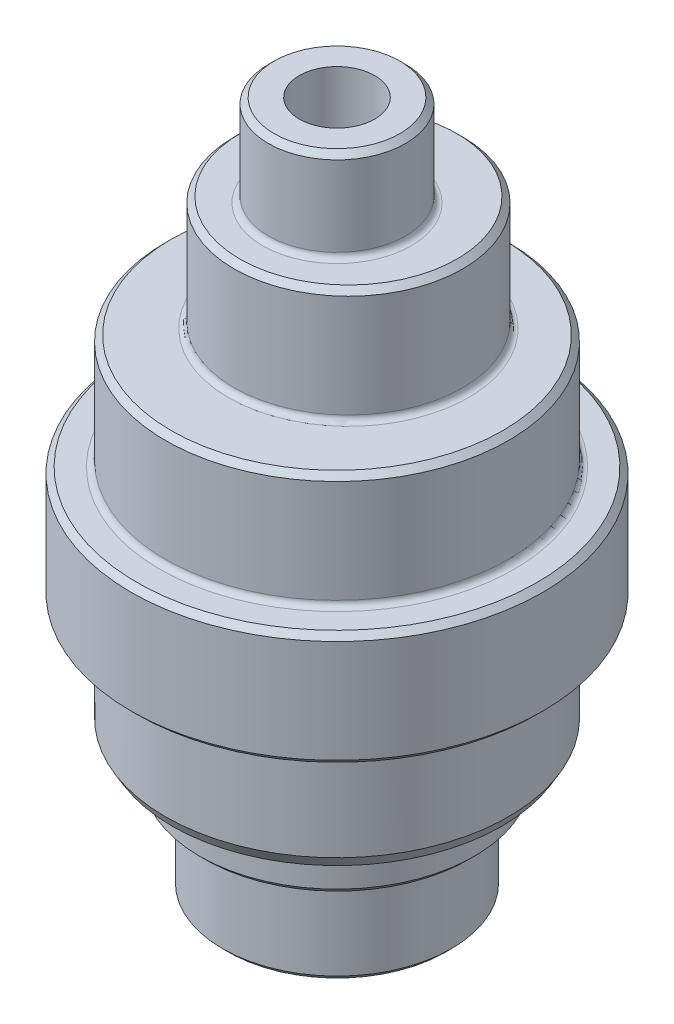
ISO-10303-21;
HEADER;
FILE_DESCRIPTION(('STEP AP214'),'2;1');
FILE_NAME('part.step','',(''),(''),'','','');
FILE_SCHEMA(('AUTOMOTIVE_DESIGN { 1 0 10303 214 1 1 1 1 }'));
ENDSEC;
DATA;
#1=APPLICATION_CONTEXT('core data for automotive mechanical design processes');
#2=APPLICATION_PROTOCOL_DEFINITION('international standard','automotive_design',2000,#1);
#3=PRODUCT_CONTEXT('',#1,'mechanical');
#4=PRODUCT('Part','Part','',(#3));
#5=PRODUCT_RELATED_PRODUCT_CATEGORY('part','',(#4));
#6=PRODUCT_DEFINITION_FORMATION('','',#4);
#7=PRODUCT_DEFINITION_CONTEXT('part definition',#1,'design');
#8=PRODUCT_DEFINITION('design','',#6,#7);
#9=PRODUCT_DEFINITION_SHAPE('','',#8);
#10=(LENGTH_UNIT() NAMED_UNIT(*) SI_UNIT(.MILLI.,.METRE.));
#11=(NAMED_UNIT(*) PLANE_ANGLE_UNIT() SI_UNIT($,.RADIAN.));
#12=(NAMED_UNIT(*) SI_UNIT($,.STERADIAN.) SOLID_ANGLE_UNIT());
#13=UNCERTAINTY_MEASURE_WITH_UNIT(LENGTH_MEASURE(1.E-05),#10,'distance_accuracy_value','');
#14=(GEOMETRIC_REPRESENTATION_CONTEXT(3) GLOBAL_UNCERTAINTY_ASSIGNED_CONTEXT((#13)) GLOBAL_UNIT_ASSIGNED_CONTEXT((#10,
#11,#12)) REPRESENTATION_CONTEXT('',''));
#15=CARTESIAN_POINT('',(0.,0.,0.));
#16=DIRECTION('',(0.,0.,1.));
#17=DIRECTION('',(1.,0.,0.));
#18=AXIS2_PLACEMENT_3D('',#15,#16,#17);
#19=CARTESIAN_POINT('',(0.,-15.,0.5));
#20=DIRECTION('',(0.,-1.,0.));
#21=DIRECTION('',(0.,0.,-1.));
#22=AXIS2_PLACEMENT_3D('',#19,#20,#21);
#23=PLANE('',#22);
#24=CARTESIAN_POINT('',(0.,-15.,0.5));
#25=DIRECTION('',(0.,-1.,0.));
#26=DIRECTION('',(0.,0.,-1.));
#27=AXIS2_PLACEMENT_3D('',#24,#25,#26);
#28=CIRCLE('',#27,7.21132486540519);
#29=CARTESIAN_POINT('',(0.,-15.,-6.71132486540519));
#30=VERTEX_POINT('',#29);
#31=EDGE_CURVE('E11',#30,#30,#28,.T.);
#32=ORIENTED_EDGE('',*,*,#31,.T.);
#33=EDGE_LOOP('',(#32));
#34=FACE_BOUND('',#33,.T.);
#35=CARTESIAN_POINT('',(0.,-15.,0.5));
#36=DIRECTION('',(0.,-1.,0.));
#37=DIRECTION('',(0.,0.,-1.));
#38=AXIS2_PLACEMENT_3D('',#35,#36,#37);
#39=CIRCLE('',#38,6.25);
#40=CARTESIAN_POINT('',(0.,-15.,-5.75));
#41=VERTEX_POINT('',#40);
#42=EDGE_CURVE('E139',#41,#41,#39,.F.);
#43=ORIENTED_EDGE('',*,*,#42,.T.);
#44=EDGE_LOOP('',(#43));
#45=FACE_BOUND('',#44,.T.);
#46=ADVANCED_FACE('F46',(#34,#45),#23,.T.);
#47=CARTESIAN_POINT('',(0.,-15.,0.5));
#48=DIRECTION('',(0.,1.,0.));
#49=DIRECTION('',(0.,0.,1.));
#50=AXIS2_PLACEMENT_3D('',#47,#48,#49);
#51=CYLINDRICAL_SURFACE('',#50,7.5);
#52=CARTESIAN_POINT('',(0.,-4.75000000000001,0.5));
#53=DIRECTION('',(0.,-1.,0.));
#54=DIRECTION('',(0.,0.,-1.));
#55=AXIS2_PLACEMENT_3D('',#52,#53,#54);
#56=CIRCLE('',#55,7.5);
#57=CARTESIAN_POINT('',(0.,-4.75000000000001,-7.));
#58=VERTEX_POINT('',#57);
#59=EDGE_CURVE('E155',#58,#58,#56,.F.);
#60=ORIENTED_EDGE('',*,*,#59,.T.);
#61=EDGE_LOOP('',(#60));
#62=FACE_BOUND('',#61,.T.);
#63=CARTESIAN_POINT('',(0.,-0.250000000000007,0.5));
#64=DIRECTION('',(0.,-1.,0.));
#65=DIRECTION('',(0.,0.,-1.));
#66=AXIS2_PLACEMENT_3D('',#63,#64,#65);
#67=CIRCLE('',#66,7.5);
#68=CARTESIAN_POINT('',(0.,-0.250000000000007,-7.));
#69=VERTEX_POINT('',#68);
#70=EDGE_CURVE('E103',#69,#69,#67,.T.);
#71=ORIENTED_EDGE('',*,*,#70,.T.);
#72=EDGE_LOOP('',(#71));
#73=FACE_BOUND('',#72,.T.);
#74=ADVANCED_FACE('F208',(#62,#73),#51,.T.);
#75=CARTESIAN_POINT('',(0.,5.,0.));
#76=DIRECTION('',(0.,-1.,0.));
#77=DIRECTION('',(0.,0.,-1.));
#78=AXIS2_PLACEMENT_3D('',#75,#76,#77);
#79=CYLINDRICAL_SURFACE('',#78,5.);
#80=CARTESIAN_POINT('',(0.,0.25,0.));
#81=DIRECTION('',(0.,-1.,0.));
#82=DIRECTION('',(0.,0.,-1.));
#83=AXIS2_PLACEMENT_3D('',#80,#81,#82);
#84=CIRCLE('',#83,5.);
#85=CARTESIAN_POINT('',(0.,0.25,-5.));
#86=VERTEX_POINT('',#85);
#87=EDGE_CURVE('E123',#86,#86,#84,.F.);
#88=ORIENTED_EDGE('',*,*,#87,.T.);
#89=EDGE_LOOP('',(#88));
#90=FACE_BOUND('',#89,.T.);
#91=CARTESIAN_POINT('',(0.,4.75000000000001,0.));
#92=DIRECTION('',(0.,1.,0.));
#93=DIRECTION('',(0.,0.,1.));
#94=AXIS2_PLACEMENT_3D('',#91,#92,#93);
#95=CIRCLE('',#94,5.);
#96=CARTESIAN_POINT('',(0.,4.75000000000001,5.));
#97=VERTEX_POINT('',#96);
#98=EDGE_CURVE('E99',#97,#97,#95,.F.);
#99=ORIENTED_EDGE('',*,*,#98,.T.);
#100=EDGE_LOOP('',(#99));
#101=FACE_BOUND('',#100,.T.);
#102=ADVANCED_FACE('F214',(#90,#101),#79,.T.);
#103=CARTESIAN_POINT('',(0.,5.,0.));
#104=DIRECTION('',(0.,1.,0.));
#105=DIRECTION('',(0.,0.,1.));
#106=AXIS2_PLACEMENT_3D('',#103,#104,#105);
#107=PLANE('',#106);
#108=CARTESIAN_POINT('',(0.,5.,0.5));
#109=DIRECTION('',(0.,1.,0.));
#110=DIRECTION('',(0.,0.,1.));
#111=AXIS2_PLACEMENT_3D('',#108,#109,#110);
#112=CIRCLE('',#111,3.25);
#113=CARTESIAN_POINT('',(0.,5.,3.75));
#114=VERTEX_POINT('',#113);
#115=EDGE_CURVE('E115',#114,#114,#112,.F.);
#116=ORIENTED_EDGE('',*,*,#115,.T.);
#117=EDGE_LOOP('',(#116));
#118=FACE_BOUND('',#117,.T.);
#119=CARTESIAN_POINT('',(0.,5.,0.));
#120=DIRECTION('',(0.,1.,0.));
#121=DIRECTION('',(0.,0.,1.));
#122=AXIS2_PLACEMENT_3D('',#119,#120,#121);
#123=CIRCLE('',#122,4.75000000000001);
#124=CARTESIAN_POINT('',(0.,5.,4.75000000000001));
#125=VERTEX_POINT('',#124);
#126=EDGE_CURVE('E95',#125,#125,#123,.T.);
#127=ORIENTED_EDGE('',*,*,#126,.T.);
#128=EDGE_LOOP('',(#127));
#129=FACE_BOUND('',#128,.T.);
#130=ADVANCED_FACE('F313',(#118,#129),#107,.T.);
#131=CARTESIAN_POINT('',(0.,9.,0.5));
#132=DIRECTION('',(0.,-1.,0.));
#133=DIRECTION('',(0.,0.,-1.));
#134=AXIS2_PLACEMENT_3D('',#131,#132,#133);
#135=CYLINDRICAL_SURFACE('',#134,3.);
#136=CARTESIAN_POINT('',(0.,5.25,0.5));
#137=DIRECTION('',(0.,1.,0.));
#138=DIRECTION('',(0.,0.,1.));
#139=AXIS2_PLACEMENT_3D('',#136,#137,#138);
#140=CIRCLE('',#139,3.);
#141=CARTESIAN_POINT('',(0.,5.25,3.5));
#142=VERTEX_POINT('',#141);
#143=EDGE_CURVE('E111',#142,#142,#140,.T.);
#144=ORIENTED_EDGE('',*,*,#143,.T.);
#145=EDGE_LOOP('',(#144));
#146=FACE_BOUND('',#145,.T.);
#147=CARTESIAN_POINT('',(0.,8.75,0.5));
#148=DIRECTION('',(0.,1.,0.));
#149=DIRECTION('',(0.,0.,1.));
#150=AXIS2_PLACEMENT_3D('',#147,#148,#149);
#151=CIRCLE('',#150,3.);
#152=CARTESIAN_POINT('',(0.,8.75,3.5));
#153=VERTEX_POINT('',#152);
#154=EDGE_CURVE('E91',#153,#153,#151,.F.);
#155=ORIENTED_EDGE('',*,*,#154,.T.);
#156=EDGE_LOOP('',(#155));
#157=FACE_BOUND('',#156,.T.);
#158=ADVANCED_FACE('F317',(#146,#157),#135,.T.);
#159=CARTESIAN_POINT('',(0.,9.,0.5));
#160=DIRECTION('',(0.,1.,0.));
#161=DIRECTION('',(0.,0.,1.));
#162=AXIS2_PLACEMENT_3D('',#159,#160,#161);
#163=PLANE('',#162);
#164=CARTESIAN_POINT('',(0.,9.,0.5));
#165=DIRECTION('',(0.,1.,0.));
#166=DIRECTION('',(0.,0.,1.));
#167=AXIS2_PLACEMENT_3D('',#164,#165,#166);
#168=CIRCLE('',#167,1.64999999999999);
#169=CARTESIAN_POINT('',(0.,9.,2.14999999999999));
#170=VERTEX_POINT('',#169);
#171=EDGE_CURVE('E72',#170,#170,#168,.T.);
#172=ORIENTED_EDGE('',*,*,#171,.F.);
#173=EDGE_LOOP('',(#172));
#174=FACE_BOUND('',#173,.T.);
#175=CARTESIAN_POINT('',(0.,9.,0.5));
#176=DIRECTION('',(0.,1.,0.));
#177=DIRECTION('',(0.,0.,1.));
#178=AXIS2_PLACEMENT_3D('',#175,#176,#177);
#179=CIRCLE('',#178,2.75);
#180=CARTESIAN_POINT('',(0.,9.,3.25));
#181=VERTEX_POINT('',#180);
#182=EDGE_CURVE('E87',#181,#181,#179,.T.);
#183=ORIENTED_EDGE('',*,*,#182,.T.);
#184=EDGE_LOOP('',(#183));
#185=FACE_BOUND('',#184,.T.);
#186=ADVANCED_FACE('F321',(#174,#185),#163,.T.);
#187=CARTESIAN_POINT('',(0.,0.,0.5));
#188=DIRECTION('',(0.,-1.,0.));
#189=DIRECTION('',(0.,0.,-1.));
#190=AXIS2_PLACEMENT_3D('',#187,#188,#189);
#191=PLANE('',#190);
#192=CARTESIAN_POINT('',(0.,0.,0.));
#193=DIRECTION('',(0.,-1.,0.));
#194=DIRECTION('',(0.,0.,-1.));
#195=AXIS2_PLACEMENT_3D('',#192,#193,#194);
#196=CIRCLE('',#195,5.25);
#197=CARTESIAN_POINT('',(0.,0.,-5.25));
#198=VERTEX_POINT('',#197);
#199=EDGE_CURVE('E119',#198,#198,#196,.T.);
#200=ORIENTED_EDGE('',*,*,#199,.T.);
#201=EDGE_LOOP('',(#200));
#202=FACE_BOUND('',#201,.T.);
#203=CARTESIAN_POINT('',(0.,0.,0.5));
#204=DIRECTION('',(0.,-1.,0.));
#205=DIRECTION('',(0.,0.,-1.));
#206=AXIS2_PLACEMENT_3D('',#203,#204,#205);
#207=CIRCLE('',#206,7.24999999999999);
#208=CARTESIAN_POINT('',(0.,0.,-6.74999999999999));
#209=VERTEX_POINT('',#208);
#210=EDGE_CURVE('E107',#209,#209,#207,.F.);
#211=ORIENTED_EDGE('',*,*,#210,.T.);
#212=EDGE_LOOP('',(#211));
#213=FACE_BOUND('',#212,.T.);
#214=ADVANCED_FACE('F220',(#202,#213),#191,.F.);
#215=CARTESIAN_POINT('',(0.,9.,0.5));
#216=DIRECTION('',(0.,-1.,0.));
#217=DIRECTION('',(0.,0.,-1.));
#218=AXIS2_PLACEMENT_3D('',#215,#216,#217);
#219=CONICAL_SURFACE('',#218,2.75,0.785398163397454);
#220=ORIENTED_EDGE('',*,*,#154,.F.);
#221=EDGE_LOOP('',(#220));
#222=FACE_BOUND('',#221,.T.);
#223=ORIENTED_EDGE('',*,*,#182,.F.);
#224=EDGE_LOOP('',(#223));
#225=FACE_BOUND('',#224,.T.);
#226=ADVANCED_FACE('F221',(#222,#225),#219,.T.);
#227=CARTESIAN_POINT('',(0.,5.,0.));
#228=DIRECTION('',(0.,-1.,0.));
#229=DIRECTION('',(0.,0.,-1.));
#230=AXIS2_PLACEMENT_3D('',#227,#228,#229);
#231=CONICAL_SURFACE('',#230,4.75000000000001,0.785398163397455);
#232=ORIENTED_EDGE('',*,*,#98,.F.);
#233=EDGE_LOOP('',(#232));
#234=FACE_BOUND('',#233,.T.);
#235=ORIENTED_EDGE('',*,*,#126,.F.);
#236=EDGE_LOOP('',(#235));
#237=FACE_BOUND('',#236,.T.);
#238=ADVANCED_FACE('F224',(#234,#237),#231,.T.);
#239=CARTESIAN_POINT('',(0.,-0.250000000000007,0.5));
#240=DIRECTION('',(0.,-1.,0.));
#241=DIRECTION('',(0.,0.,-1.));
#242=AXIS2_PLACEMENT_3D('',#239,#240,#241);
#243=CONICAL_SURFACE('',#242,7.5,0.785398163397448);
#244=ORIENTED_EDGE('',*,*,#210,.F.);
#245=EDGE_LOOP('',(#244));
#246=FACE_BOUND('',#245,.T.);
#247=ORIENTED_EDGE('',*,*,#70,.F.);
#248=EDGE_LOOP('',(#247));
#249=FACE_BOUND('',#248,.T.);
#250=ADVANCED_FACE('F228',(#246,#249),#243,.T.);
#251=CARTESIAN_POINT('',(0.,5.25,0.5));
#252=DIRECTION('',(0.,1.,0.));
#253=DIRECTION('',(0.,0.,1.));
#254=AXIS2_PLACEMENT_3D('',#251,#252,#253);
#255=TOROIDAL_SURFACE('',#254,3.25,0.25);
#256=ORIENTED_EDGE('',*,*,#115,.F.);
#257=EDGE_LOOP('',(#256));
#258=FACE_BOUND('',#257,.T.);
#259=ORIENTED_EDGE('',*,*,#143,.F.);
#260=EDGE_LOOP('',(#259));
#261=FACE_BOUND('',#260,.T.);
#262=ADVANCED_FACE('F232',(#258,#261),#255,.F.);
#263=CARTESIAN_POINT('',(0.,0.25,0.));
#264=DIRECTION('',(0.,-1.,0.));
#265=DIRECTION('',(0.,0.,-1.));
#266=AXIS2_PLACEMENT_3D('',#263,#264,#265);
#267=TOROIDAL_SURFACE('',#266,5.25,0.25);
#268=ORIENTED_EDGE('',*,*,#87,.F.);
#269=EDGE_LOOP('',(#268));
#270=FACE_BOUND('',#269,.T.);
#271=ORIENTED_EDGE('',*,*,#199,.F.);
#272=EDGE_LOOP('',(#271));
#273=FACE_BOUND('',#272,.T.);
#274=ADVANCED_FACE('F236',(#270,#273),#267,.F.);
#275=CARTESIAN_POINT('',(0.,0.5,0.5));
#276=DIRECTION('',(0.,1.,0.));
#277=DIRECTION('',(0.,0.,1.));
#278=AXIS2_PLACEMENT_3D('',#275,#276,#277);
#279=CONICAL_SURFACE('',#278,1.65,1.02974425867665);
#280=CARTESIAN_POINT('',(0.,-0.491420021395475,0.5));
#281=VERTEX_POINT('',#280);
#282=VERTEX_LOOP('',#281);
#283=FACE_BOUND('',#282,.T.);
#284=CARTESIAN_POINT('',(0.,0.5,0.5));
#285=DIRECTION('',(0.,1.,0.));
#286=DIRECTION('',(0.,0.,1.));
#287=AXIS2_PLACEMENT_3D('',#284,#285,#286);
#288=CIRCLE('',#287,1.65);
#289=CARTESIAN_POINT('',(0.,0.5,2.15));
#290=VERTEX_POINT('',#289);
#291=EDGE_CURVE('E79',#290,#290,#288,.T.);
#292=ORIENTED_EDGE('',*,*,#291,.T.);
#293=EDGE_LOOP('',(#292));
#294=FACE_BOUND('',#293,.T.);
#295=ADVANCED_FACE('F240',(#283,#294),#279,.F.);
#296=CARTESIAN_POINT('',(0.,9.,0.5));
#297=DIRECTION('',(0.,1.,0.));
#298=DIRECTION('',(0.,0.,1.));
#299=AXIS2_PLACEMENT_3D('',#296,#297,#298);
#300=CYLINDRICAL_SURFACE('',#299,1.64999999999999);
#301=ORIENTED_EDGE('',*,*,#291,.F.);
#302=EDGE_LOOP('',(#301));
#303=FACE_BOUND('',#302,.T.);
#304=ORIENTED_EDGE('',*,*,#171,.T.);
#305=EDGE_LOOP('',(#304));
#306=FACE_BOUND('',#305,.T.);
#307=ADVANCED_FACE('F304',(#303,#306),#300,.F.);
#308=CARTESIAN_POINT('',(0.,-5.00000000000001,0.499999999999998));
#309=DIRECTION('',(0.,-1.,0.));
#310=DIRECTION('',(0.,0.,-1.));
#311=AXIS2_PLACEMENT_3D('',#308,#309,#310);
#312=PLANE('',#311);
#313=CARTESIAN_POINT('',(0.,-5.00000000000001,0.499999999999998));
#314=DIRECTION('',(0.,-1.,0.));
#315=DIRECTION('',(0.,0.,-1.));
#316=AXIS2_PLACEMENT_3D('',#313,#314,#315);
#317=CIRCLE('',#316,8.75);
#318=CARTESIAN_POINT('',(0.,-5.00000000000001,-8.25));
#319=VERTEX_POINT('',#318);
#320=EDGE_CURVE('E171',#319,#319,#317,.F.);
#321=ORIENTED_EDGE('',*,*,#320,.T.);
#322=EDGE_LOOP('',(#321));
#323=FACE_BOUND('',#322,.T.);
#324=CARTESIAN_POINT('',(0.,-5.00000000000001,0.5));
#325=DIRECTION('',(0.,-1.,0.));
#326=DIRECTION('',(0.,0.,-1.));
#327=AXIS2_PLACEMENT_3D('',#324,#325,#326);
#328=CIRCLE('',#327,7.75);
#329=CARTESIAN_POINT('',(0.,-5.00000000000001,-7.25));
#330=VERTEX_POINT('',#329);
#331=EDGE_CURVE('E151',#330,#330,#328,.T.);
#332=ORIENTED_EDGE('',*,*,#331,.T.);
#333=EDGE_LOOP('',(#332));
#334=FACE_BOUND('',#333,.T.);
#335=ADVANCED_FACE('F300',(#323,#334),#312,.F.);
#336=CARTESIAN_POINT('',(0.,9.,0.5));
#337=DIRECTION('',(0.,1.,0.));
#338=DIRECTION('',(0.,0.,1.));
#339=AXIS2_PLACEMENT_3D('',#336,#337,#338);
#340=CYLINDRICAL_SURFACE('',#339,9.);
#341=CARTESIAN_POINT('',(0.,-9.74900630383361,0.499999999999998));
#342=DIRECTION('',(0.,1.,0.));
#343=DIRECTION('',(0.,0.,1.));
#344=AXIS2_PLACEMENT_3D('',#341,#342,#343);
#345=CIRCLE('',#344,9.);
#346=CARTESIAN_POINT('',(0.,-9.74900630383361,9.49999999999999));
#347=VERTEX_POINT('',#346);
#348=EDGE_CURVE('E163',#347,#347,#345,.T.);
#349=ORIENTED_EDGE('',*,*,#348,.T.);
#350=EDGE_LOOP('',(#349));
#351=FACE_BOUND('',#350,.T.);
#352=CARTESIAN_POINT('',(0.,-5.25000000000001,0.499999999999998));
#353=DIRECTION('',(0.,-1.,0.));
#354=DIRECTION('',(0.,0.,-1.));
#355=AXIS2_PLACEMENT_3D('',#352,#353,#354);
#356=CIRCLE('',#355,9.);
#357=CARTESIAN_POINT('',(0.,-5.25000000000001,-8.5));
#358=VERTEX_POINT('',#357);
#359=EDGE_CURVE('E159',#358,#358,#356,.T.);
#360=ORIENTED_EDGE('',*,*,#359,.T.);
#361=EDGE_LOOP('',(#360));
#362=FACE_BOUND('',#361,.T.);
#363=ADVANCED_FACE('F296',(#351,#362),#340,.T.);
#364=CARTESIAN_POINT('',(0.,-9.99900630383361,0.499999999999998));
#365=DIRECTION('',(0.,1.,0.));
#366=DIRECTION('',(0.,0.,1.));
#367=AXIS2_PLACEMENT_3D('',#364,#365,#366);
#368=PLANE('',#367);
#369=CARTESIAN_POINT('',(0.,-9.99900630383361,0.499999999999998));
#370=DIRECTION('',(0.,1.,0.));
#371=DIRECTION('',(0.,0.,1.));
#372=AXIS2_PLACEMENT_3D('',#369,#370,#371);
#373=CIRCLE('',#372,8.75);
#374=CARTESIAN_POINT('',(0.,-9.99900630383361,9.24999999999999));
#375=VERTEX_POINT('',#374);
#376=EDGE_CURVE('E167',#375,#375,#373,.F.);
#377=ORIENTED_EDGE('',*,*,#376,.T.);
#378=EDGE_LOOP('',(#377));
#379=FACE_BOUND('',#378,.T.);
#380=CARTESIAN_POINT('',(0.,-9.99900630383361,0.5));
#381=DIRECTION('',(0.,1.,0.));
#382=DIRECTION('',(0.,0.,1.));
#383=AXIS2_PLACEMENT_3D('',#380,#381,#382);
#384=CIRCLE('',#383,7.75);
#385=CARTESIAN_POINT('',(0.,-9.99900630383361,8.25));
#386=VERTEX_POINT('',#385);
#387=EDGE_CURVE('E143',#386,#386,#384,.T.);
#388=ORIENTED_EDGE('',*,*,#387,.T.);
#389=EDGE_LOOP('',(#388));
#390=FACE_BOUND('',#389,.T.);
#391=ADVANCED_FACE('F293',(#379,#390),#368,.F.);
#392=CARTESIAN_POINT('',(0.,-14.5,0.5));
#393=DIRECTION('',(0.,-1.,0.));
#394=DIRECTION('',(0.,0.,-1.));
#395=AXIS2_PLACEMENT_3D('',#392,#393,#394);
#396=CIRCLE('',#395,7.5);
#397=CARTESIAN_POINT('',(0.,-14.5,-7.));
#398=VERTEX_POINT('',#397);
#399=EDGE_CURVE('E55',#398,#398,#396,.F.);
#400=ORIENTED_EDGE('',*,*,#399,.T.);
#401=EDGE_LOOP('',(#400));
#402=FACE_BOUND('',#401,.T.);
#403=CARTESIAN_POINT('',(0.,-10.2490063038336,0.5));
#404=DIRECTION('',(0.,1.,0.));
#405=DIRECTION('',(0.,0.,1.));
#406=AXIS2_PLACEMENT_3D('',#403,#404,#405);
#407=CIRCLE('',#406,7.5);
#408=CARTESIAN_POINT('',(0.,-10.2490063038336,8.));
#409=VERTEX_POINT('',#408);
#410=EDGE_CURVE('E147',#409,#409,#407,.F.);
#411=ORIENTED_EDGE('',*,*,#410,.T.);
#412=EDGE_LOOP('',(#411));
#413=FACE_BOUND('',#412,.T.);
#414=ADVANCED_FACE('F195',(#402,#413),#51,.T.);
#415=CARTESIAN_POINT('',(0.,-17.,0.5));
#416=DIRECTION('',(0.,-1.,0.));
#417=DIRECTION('',(0.,0.,-1.));
#418=AXIS2_PLACEMENT_3D('',#415,#416,#417);
#419=PLANE('',#418);
#420=CARTESIAN_POINT('',(0.,-17.,0.5));
#421=DIRECTION('',(0.,-1.,0.));
#422=DIRECTION('',(0.,0.,-1.));
#423=AXIS2_PLACEMENT_3D('',#420,#421,#422);
#424=CIRCLE('',#423,5.75);
#425=CARTESIAN_POINT('',(0.,-17.,-5.25));
#426=VERTEX_POINT('',#425);
#427=EDGE_CURVE('E175',#426,#426,#424,.T.);
#428=ORIENTED_EDGE('',*,*,#427,.T.);
#429=EDGE_LOOP('',(#428));
#430=FACE_BOUND('',#429,.T.);
#431=CARTESIAN_POINT('',(0.,-17.,0.5));
#432=DIRECTION('',(0.,-1.,0.));
#433=DIRECTION('',(0.,0.,-1.));
#434=AXIS2_PLACEMENT_3D('',#431,#432,#433);
#435=CIRCLE('',#434,5.25);
#436=CARTESIAN_POINT('',(0.,-17.,-4.75));
#437=VERTEX_POINT('',#436);
#438=EDGE_CURVE('E131',#437,#437,#435,.F.);
#439=ORIENTED_EDGE('',*,*,#438,.T.);
#440=EDGE_LOOP('',(#439));
#441=FACE_BOUND('',#440,.T.);
#442=ADVANCED_FACE('F275',(#430,#441),#419,.T.);
#443=CARTESIAN_POINT('',(0.,-17.,0.5));
#444=DIRECTION('',(0.,1.,0.));
#445=DIRECTION('',(0.,0.,1.));
#446=AXIS2_PLACEMENT_3D('',#443,#444,#445);
#447=CYLINDRICAL_SURFACE('',#446,6.);
#448=CARTESIAN_POINT('',(0.,-16.75,0.5));
#449=DIRECTION('',(0.,-1.,0.));
#450=DIRECTION('',(0.,0.,-1.));
#451=AXIS2_PLACEMENT_3D('',#448,#449,#450);
#452=CIRCLE('',#451,6.);
#453=CARTESIAN_POINT('',(0.,-16.75,-5.5));
#454=VERTEX_POINT('',#453);
#455=EDGE_CURVE('E179',#454,#454,#452,.F.);
#456=ORIENTED_EDGE('',*,*,#455,.T.);
#457=EDGE_LOOP('',(#456));
#458=FACE_BOUND('',#457,.T.);
#459=CARTESIAN_POINT('',(0.,-15.25,0.5));
#460=DIRECTION('',(0.,-1.,0.));
#461=DIRECTION('',(0.,0.,-1.));
#462=AXIS2_PLACEMENT_3D('',#459,#460,#461);
#463=CIRCLE('',#462,6.);
#464=CARTESIAN_POINT('',(0.,-15.25,-5.5));
#465=VERTEX_POINT('',#464);
#466=EDGE_CURVE('E135',#465,#465,#463,.T.);
#467=ORIENTED_EDGE('',*,*,#466,.T.);
#468=EDGE_LOOP('',(#467));
#469=FACE_BOUND('',#468,.T.);
#470=ADVANCED_FACE('F65',(#458,#469),#447,.T.);
#471=CARTESIAN_POINT('',(0.,-12.5,0.5));
#472=DIRECTION('',(0.,-1.,0.));
#473=DIRECTION('',(0.,0.,-1.));
#474=AXIS2_PLACEMENT_3D('',#471,#472,#473);
#475=CONICAL_SURFACE('',#474,1.65,1.02974425867665);
#476=CARTESIAN_POINT('',(0.,-11.5085799786045,0.5));
#477=VERTEX_POINT('',#476);
#478=VERTEX_LOOP('',#477);
#479=FACE_BOUND('',#478,.T.);
#480=CARTESIAN_POINT('',(0.,-12.5,0.5));
#481=DIRECTION('',(0.,-1.,0.));
#482=DIRECTION('',(0.,0.,-1.));
#483=AXIS2_PLACEMENT_3D('',#480,#481,#482);
#484=CIRCLE('',#483,1.65);
#485=CARTESIAN_POINT('',(0.,-12.5,-1.15));
#486=VERTEX_POINT('',#485);
#487=EDGE_CURVE('E69',#486,#486,#484,.T.);
#488=ORIENTED_EDGE('',*,*,#487,.T.);
#489=EDGE_LOOP('',(#488));
#490=FACE_BOUND('',#489,.T.);
#491=ADVANCED_FACE('F61',(#479,#490),#475,.F.);
#492=CARTESIAN_POINT('',(0.,-21.,0.5));
#493=DIRECTION('',(0.,-1.,0.));
#494=DIRECTION('',(0.,0.,-1.));
#495=AXIS2_PLACEMENT_3D('',#492,#493,#494);
#496=CYLINDRICAL_SURFACE('',#495,1.64999999999999);
#497=ORIENTED_EDGE('',*,*,#487,.F.);
#498=EDGE_LOOP('',(#497));
#499=FACE_BOUND('',#498,.T.);
#500=CARTESIAN_POINT('',(0.,-21.,0.5));
#501=DIRECTION('',(0.,-1.,0.));
#502=DIRECTION('',(0.,0.,-1.));
#503=AXIS2_PLACEMENT_3D('',#500,#501,#502);
#504=CIRCLE('',#503,1.64999999999999);
#505=CARTESIAN_POINT('',(0.,-21.,-1.14999999999999));
#506=VERTEX_POINT('',#505);
#507=EDGE_CURVE('E73',#506,#506,#504,.T.);
#508=ORIENTED_EDGE('',*,*,#507,.T.);
#509=EDGE_LOOP('',(#508));
#510=FACE_BOUND('',#509,.T.);
#511=ADVANCED_FACE('F64',(#499,#510),#496,.F.);
#512=CARTESIAN_POINT('',(0.,-21.,0.5));
#513=DIRECTION('',(0.,-1.,0.));
#514=DIRECTION('',(0.,0.,-1.));
#515=AXIS2_PLACEMENT_3D('',#512,#513,#514);
#516=PLANE('',#515);
#517=CARTESIAN_POINT('',(0.,-21.,0.5));
#518=DIRECTION('',(0.,-1.,0.));
#519=DIRECTION('',(0.,0.,-1.));
#520=AXIS2_PLACEMENT_3D('',#517,#518,#519);
#521=CIRCLE('',#520,4.75);
#522=CARTESIAN_POINT('',(0.,-21.,-4.25));
#523=VERTEX_POINT('',#522);
#524=EDGE_CURVE('E183',#523,#523,#521,.T.);
#525=ORIENTED_EDGE('',*,*,#524,.T.);
#526=EDGE_LOOP('',(#525));
#527=FACE_BOUND('',#526,.T.);
#528=ORIENTED_EDGE('',*,*,#507,.F.);
#529=EDGE_LOOP('',(#528));
#530=FACE_BOUND('',#529,.T.);
#531=ADVANCED_FACE('F284',(#527,#530),#516,.T.);
#532=CARTESIAN_POINT('',(0.,-21.,0.5));
#533=DIRECTION('',(0.,1.,0.));
#534=DIRECTION('',(0.,0.,1.));
#535=AXIS2_PLACEMENT_3D('',#532,#533,#534);
#536=CYLINDRICAL_SURFACE('',#535,5.);
#537=CARTESIAN_POINT('',(0.,-20.75,0.5));
#538=DIRECTION('',(0.,-1.,0.));
#539=DIRECTION('',(0.,0.,-1.));
#540=AXIS2_PLACEMENT_3D('',#537,#538,#539);
#541=CIRCLE('',#540,5.);
#542=CARTESIAN_POINT('',(0.,-20.75,-4.5));
#543=VERTEX_POINT('',#542);
#544=EDGE_CURVE('E187',#543,#543,#541,.F.);
#545=ORIENTED_EDGE('',*,*,#544,.T.);
#546=EDGE_LOOP('',(#545));
#547=FACE_BOUND('',#546,.T.);
#548=CARTESIAN_POINT('',(0.,-17.25,0.5));
#549=DIRECTION('',(0.,-1.,0.));
#550=DIRECTION('',(0.,0.,-1.));
#551=AXIS2_PLACEMENT_3D('',#548,#549,#550);
#552=CIRCLE('',#551,5.);
#553=CARTESIAN_POINT('',(0.,-17.25,-4.5));
#554=VERTEX_POINT('',#553);
#555=EDGE_CURVE('E127',#554,#554,#552,.T.);
#556=ORIENTED_EDGE('',*,*,#555,.T.);
#557=EDGE_LOOP('',(#556));
#558=FACE_BOUND('',#557,.T.);
#559=ADVANCED_FACE('F246',(#547,#558),#536,.T.);
#560=CARTESIAN_POINT('',(0.,-17.25,0.5));
#561=DIRECTION('',(0.,-1.,0.));
#562=DIRECTION('',(0.,0.,-1.));
#563=AXIS2_PLACEMENT_3D('',#560,#561,#562);
#564=TOROIDAL_SURFACE('',#563,5.25,0.25);
#565=ORIENTED_EDGE('',*,*,#438,.F.);
#566=EDGE_LOOP('',(#565));
#567=FACE_BOUND('',#566,.T.);
#568=ORIENTED_EDGE('',*,*,#555,.F.);
#569=EDGE_LOOP('',(#568));
#570=FACE_BOUND('',#569,.T.);
#571=ADVANCED_FACE('F242',(#567,#570),#564,.F.);
#572=CARTESIAN_POINT('',(0.,-15.25,0.5));
#573=DIRECTION('',(0.,-1.,0.));
#574=DIRECTION('',(0.,0.,-1.));
#575=AXIS2_PLACEMENT_3D('',#572,#573,#574);
#576=TOROIDAL_SURFACE('',#575,6.25,0.25);
#577=ORIENTED_EDGE('',*,*,#42,.F.);
#578=EDGE_LOOP('',(#577));
#579=FACE_BOUND('',#578,.T.);
#580=ORIENTED_EDGE('',*,*,#466,.F.);
#581=EDGE_LOOP('',(#580));
#582=FACE_BOUND('',#581,.T.);
#583=ADVANCED_FACE('F245',(#579,#582),#576,.F.);
#584=CARTESIAN_POINT('',(0.,-10.2490063038336,0.5));
#585=DIRECTION('',(0.,1.,0.));
#586=DIRECTION('',(0.,0.,1.));
#587=AXIS2_PLACEMENT_3D('',#584,#585,#586);
#588=TOROIDAL_SURFACE('',#587,7.75,0.25);
#589=ORIENTED_EDGE('',*,*,#410,.F.);
#590=EDGE_LOOP('',(#589));
#591=FACE_BOUND('',#590,.T.);
#592=ORIENTED_EDGE('',*,*,#387,.F.);
#593=EDGE_LOOP('',(#592));
#594=FACE_BOUND('',#593,.T.);
#595=ADVANCED_FACE('F250',(#591,#594),#588,.F.);
#596=CARTESIAN_POINT('',(0.,-4.75000000000001,0.5));
#597=DIRECTION('',(0.,-1.,0.));
#598=DIRECTION('',(0.,0.,-1.));
#599=AXIS2_PLACEMENT_3D('',#596,#597,#598);
#600=TOROIDAL_SURFACE('',#599,7.75,0.25);
#601=ORIENTED_EDGE('',*,*,#59,.F.);
#602=EDGE_LOOP('',(#601));
#603=FACE_BOUND('',#602,.T.);
#604=ORIENTED_EDGE('',*,*,#331,.F.);
#605=EDGE_LOOP('',(#604));
#606=FACE_BOUND('',#605,.T.);
#607=ADVANCED_FACE('F254',(#603,#606),#600,.F.);
#608=CARTESIAN_POINT('',(0.,-9.74900630383361,0.499999999999998));
#609=DIRECTION('',(0.,1.,0.));
#610=DIRECTION('',(0.,0.,1.));
#611=AXIS2_PLACEMENT_3D('',#608,#609,#610);
#612=CONICAL_SURFACE('',#611,9.,0.785398163397459);
#613=ORIENTED_EDGE('',*,*,#376,.F.);
#614=EDGE_LOOP('',(#613));
#615=FACE_BOUND('',#614,.T.);
#616=ORIENTED_EDGE('',*,*,#348,.F.);
#617=EDGE_LOOP('',(#616));
#618=FACE_BOUND('',#617,.T.);
#619=ADVANCED_FACE('F258',(#615,#618),#612,.T.);
#620=CARTESIAN_POINT('',(0.,-5.00000000000001,0.499999999999998));
#621=DIRECTION('',(0.,-1.,0.));
#622=DIRECTION('',(0.,0.,-1.));
#623=AXIS2_PLACEMENT_3D('',#620,#621,#622);
#624=CONICAL_SURFACE('',#623,8.75,0.785398163397441);
#625=ORIENTED_EDGE('',*,*,#359,.F.);
#626=EDGE_LOOP('',(#625));
#627=FACE_BOUND('',#626,.T.);
#628=ORIENTED_EDGE('',*,*,#320,.F.);
#629=EDGE_LOOP('',(#628));
#630=FACE_BOUND('',#629,.T.);
#631=ADVANCED_FACE('F262',(#627,#630),#624,.T.);
#632=CARTESIAN_POINT('',(0.,-17.,0.5));
#633=DIRECTION('',(0.,1.,0.));
#634=DIRECTION('',(0.,0.,1.));
#635=AXIS2_PLACEMENT_3D('',#632,#633,#634);
#636=CONICAL_SURFACE('',#635,5.75,0.78539816339744);
#637=ORIENTED_EDGE('',*,*,#455,.F.);
#638=EDGE_LOOP('',(#637));
#639=FACE_BOUND('',#638,.T.);
#640=ORIENTED_EDGE('',*,*,#427,.F.);
#641=EDGE_LOOP('',(#640));
#642=FACE_BOUND('',#641,.T.);
#643=ADVANCED_FACE('F204',(#639,#642),#636,.T.);
#644=CARTESIAN_POINT('',(0.,-21.,0.5));
#645=DIRECTION('',(0.,1.,0.));
#646=DIRECTION('',(0.,0.,1.));
#647=AXIS2_PLACEMENT_3D('',#644,#645,#646);
#648=CONICAL_SURFACE('',#647,4.75,0.78539816339744);
#649=ORIENTED_EDGE('',*,*,#544,.F.);
#650=EDGE_LOOP('',(#649));
#651=FACE_BOUND('',#650,.T.);
#652=ORIENTED_EDGE('',*,*,#524,.F.);
#653=EDGE_LOOP('',(#652));
#654=FACE_BOUND('',#653,.T.);
#655=ADVANCED_FACE('F199',(#651,#654),#648,.T.);
#656=CARTESIAN_POINT('',(0.,-14.5,0.5));
#657=DIRECTION('',(0.,1.,0.));
#658=DIRECTION('',(0.,0.,1.));
#659=AXIS2_PLACEMENT_3D('',#656,#657,#658);
#660=CONICAL_SURFACE('',#659,7.5,0.523598775598293);
#661=ORIENTED_EDGE('',*,*,#31,.F.);
#662=EDGE_LOOP('',(#661));
#663=FACE_BOUND('',#662,.T.);
#664=ORIENTED_EDGE('',*,*,#399,.F.);
#665=EDGE_LOOP('',(#664));
#666=FACE_BOUND('',#665,.T.);
#667=ADVANCED_FACE('F48',(#663,#666),#660,.T.);
#668=CLOSED_SHELL('',(#46,#74,#102,#130,#158,#186,#214,#226,#238,#250,#262,#274,#295,#307,#335,
#363,#391,#414,#442,#470,#491,#511,#531,#559,#571,#583,#595,#607,#619,#631,#643,#655,#667));
#669=MANIFOLD_SOLID_BREP('B2',#668);
#670=ADVANCED_BREP_SHAPE_REPRESENTATION('',(#18,#669),#14);
#671=SHAPE_DEFINITION_REPRESENTATION(#9,#670);
ENDSEC;
END-ISO-10303-21;
